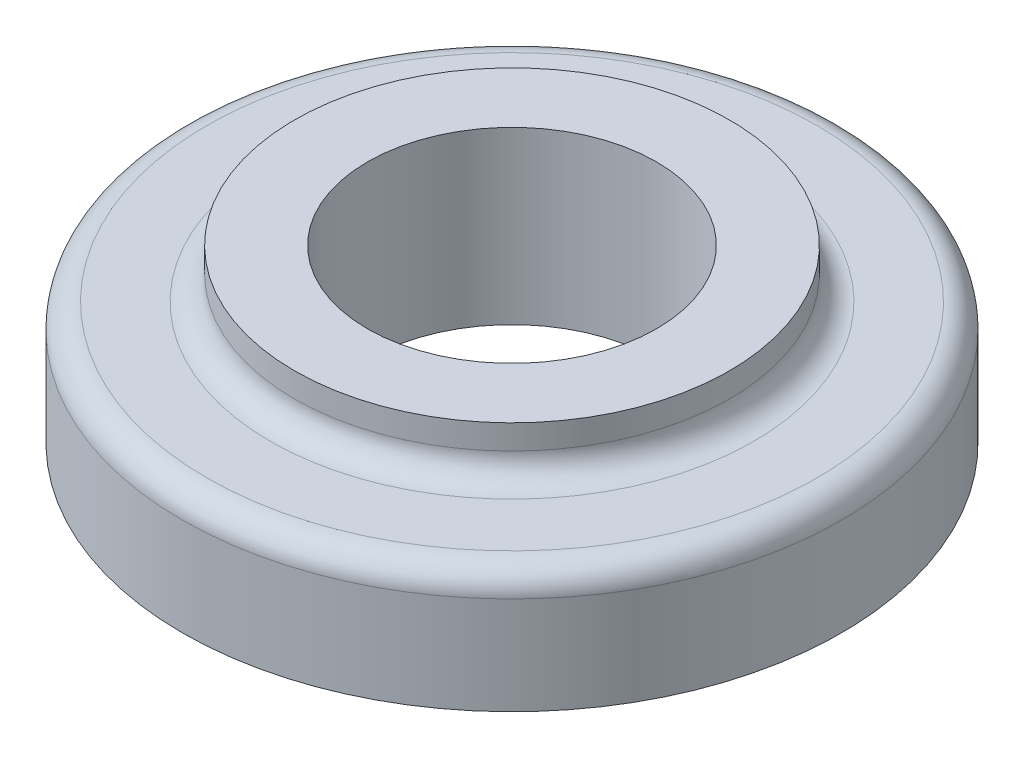
ISO-10303-21;
HEADER;
FILE_DESCRIPTION(('STEP AP214'),'2;1');
FILE_NAME('part.step','',(''),(''),'','','');
FILE_SCHEMA(('AUTOMOTIVE_DESIGN { 1 0 10303 214 1 1 1 1 }'));
ENDSEC;
DATA;
#1=APPLICATION_CONTEXT('core data for automotive mechanical design processes');
#2=APPLICATION_PROTOCOL_DEFINITION('international standard','automotive_design',2000,#1);
#3=PRODUCT_CONTEXT('',#1,'mechanical');
#4=PRODUCT('Part','Part','',(#3));
#5=PRODUCT_RELATED_PRODUCT_CATEGORY('part','',(#4));
#6=PRODUCT_DEFINITION_FORMATION('','',#4);
#7=PRODUCT_DEFINITION_CONTEXT('part definition',#1,'design');
#8=PRODUCT_DEFINITION('design','',#6,#7);
#9=PRODUCT_DEFINITION_SHAPE('','',#8);
#10=(LENGTH_UNIT() NAMED_UNIT(*) SI_UNIT(.MILLI.,.METRE.));
#11=(NAMED_UNIT(*) PLANE_ANGLE_UNIT() SI_UNIT($,.RADIAN.));
#12=(NAMED_UNIT(*) SI_UNIT($,.STERADIAN.) SOLID_ANGLE_UNIT());
#13=UNCERTAINTY_MEASURE_WITH_UNIT(LENGTH_MEASURE(1.E-05),#10,'distance_accuracy_value','');
#14=(GEOMETRIC_REPRESENTATION_CONTEXT(3) GLOBAL_UNCERTAINTY_ASSIGNED_CONTEXT((#13)) GLOBAL_UNIT_ASSIGNED_CONTEXT((#10,
#11,#12)) REPRESENTATION_CONTEXT('',''));
#15=CARTESIAN_POINT('',(0.,0.,0.));
#16=DIRECTION('',(0.,0.,1.));
#17=DIRECTION('',(1.,0.,0.));
#18=AXIS2_PLACEMENT_3D('',#15,#16,#17);
#19=CARTESIAN_POINT('',(0.,10.,0.));
#20=DIRECTION('',(0.,-1.,0.));
#21=DIRECTION('',(0.,0.,-1.));
#22=AXIS2_PLACEMENT_3D('',#19,#20,#21);
#23=CYLINDRICAL_SURFACE('',#22,27.0010222488846);
#24=CARTESIAN_POINT('',(0.,8.,0.));
#25=DIRECTION('',(0.,1.,0.));
#26=DIRECTION('',(0.,0.,1.));
#27=AXIS2_PLACEMENT_3D('',#24,#25,#26);
#28=CIRCLE('',#27,27.0010222488846);
#29=CARTESIAN_POINT('',(0.,8.,27.0010222488846));
#30=VERTEX_POINT('',#29);
#31=EDGE_CURVE('E45',#30,#30,#28,.F.);
#32=ORIENTED_EDGE('',*,*,#31,.T.);
#33=EDGE_LOOP('',(#32));
#34=FACE_BOUND('',#33,.T.);
#35=CARTESIAN_POINT('',(0.,0.,0.));
#36=DIRECTION('',(0.,1.,0.));
#37=DIRECTION('',(0.,0.,1.));
#38=AXIS2_PLACEMENT_3D('',#35,#36,#37);
#39=CIRCLE('',#38,27.0010222488846);
#40=CARTESIAN_POINT('',(0.,0.,27.0010222488846));
#41=VERTEX_POINT('',#40);
#42=EDGE_CURVE('E61',#41,#41,#39,.T.);
#43=ORIENTED_EDGE('',*,*,#42,.T.);
#44=EDGE_LOOP('',(#43));
#45=FACE_BOUND('',#44,.T.);
#46=ADVANCED_FACE('F37',(#34,#45),#23,.T.);
#47=CARTESIAN_POINT('',(0.,10.,0.));
#48=DIRECTION('',(0.,1.,0.));
#49=DIRECTION('',(0.,0.,1.));
#50=AXIS2_PLACEMENT_3D('',#47,#48,#49);
#51=PLANE('',#50);
#52=CARTESIAN_POINT('',(0.,10.,0.));
#53=DIRECTION('',(0.,1.,0.));
#54=DIRECTION('',(0.,0.,1.));
#55=AXIS2_PLACEMENT_3D('',#52,#53,#54);
#56=CIRCLE('',#55,25.0010222488846);
#57=CARTESIAN_POINT('',(0.,10.,25.0010222488846));
#58=VERTEX_POINT('',#57);
#59=EDGE_CURVE('E50',#58,#58,#56,.T.);
#60=ORIENTED_EDGE('',*,*,#59,.T.);
#61=EDGE_LOOP('',(#60));
#62=FACE_BOUND('',#61,.T.);
#63=CARTESIAN_POINT('',(0.,10.,0.));
#64=DIRECTION('',(0.,1.,0.));
#65=DIRECTION('',(0.,0.,1.));
#66=AXIS2_PLACEMENT_3D('',#63,#64,#65);
#67=CIRCLE('',#66,19.8112845061296);
#68=CARTESIAN_POINT('',(0.,10.,19.8112845061296));
#69=VERTEX_POINT('',#68);
#70=EDGE_CURVE('E55',#69,#69,#67,.F.);
#71=ORIENTED_EDGE('',*,*,#70,.T.);
#72=EDGE_LOOP('',(#71));
#73=FACE_BOUND('',#72,.T.);
#74=ADVANCED_FACE('F100',(#62,#73),#51,.T.);
#75=CARTESIAN_POINT('',(0.,0.,0.));
#76=DIRECTION('',(0.,1.,0.));
#77=DIRECTION('',(0.,0.,1.));
#78=AXIS2_PLACEMENT_3D('',#75,#76,#77);
#79=PLANE('',#78);
#80=CARTESIAN_POINT('',(0.,0.,0.));
#81=DIRECTION('',(0.,1.,0.));
#82=DIRECTION('',(0.,0.,1.));
#83=AXIS2_PLACEMENT_3D('',#80,#81,#82);
#84=CIRCLE('',#83,11.8443550233392);
#85=CARTESIAN_POINT('',(0.,0.,11.8443550233392));
#86=VERTEX_POINT('',#85);
#87=EDGE_CURVE('E69',#86,#86,#84,.T.);
#88=ORIENTED_EDGE('',*,*,#87,.T.);
#89=EDGE_LOOP('',(#88));
#90=FACE_BOUND('',#89,.T.);
#91=ORIENTED_EDGE('',*,*,#42,.F.);
#92=EDGE_LOOP('',(#91));
#93=FACE_BOUND('',#92,.T.);
#94=ADVANCED_FACE('F78',(#90,#93),#79,.F.);
#95=CARTESIAN_POINT('',(0.,14.,0.));
#96=DIRECTION('',(0.,-1.,0.));
#97=DIRECTION('',(0.,0.,-1.));
#98=AXIS2_PLACEMENT_3D('',#95,#96,#97);
#99=CYLINDRICAL_SURFACE('',#98,17.8112845061296);
#100=CARTESIAN_POINT('',(0.,12.,0.));
#101=DIRECTION('',(0.,1.,0.));
#102=DIRECTION('',(0.,0.,1.));
#103=AXIS2_PLACEMENT_3D('',#100,#101,#102);
#104=CIRCLE('',#103,17.8112845061296);
#105=CARTESIAN_POINT('',(0.,12.,17.8112845061296));
#106=VERTEX_POINT('',#105);
#107=EDGE_CURVE('E10',#106,#106,#104,.T.);
#108=ORIENTED_EDGE('',*,*,#107,.T.);
#109=EDGE_LOOP('',(#108));
#110=FACE_BOUND('',#109,.T.);
#111=CARTESIAN_POINT('',(0.,14.,0.));
#112=DIRECTION('',(0.,1.,0.));
#113=DIRECTION('',(0.,0.,1.));
#114=AXIS2_PLACEMENT_3D('',#111,#112,#113);
#115=CIRCLE('',#114,17.8112845061296);
#116=CARTESIAN_POINT('',(0.,14.,17.8112845061296));
#117=VERTEX_POINT('',#116);
#118=EDGE_CURVE('E65',#117,#117,#115,.T.);
#119=ORIENTED_EDGE('',*,*,#118,.F.);
#120=EDGE_LOOP('',(#119));
#121=FACE_BOUND('',#120,.T.);
#122=ADVANCED_FACE('F91',(#110,#121),#99,.T.);
#123=CARTESIAN_POINT('',(0.,14.,0.));
#124=DIRECTION('',(0.,1.,0.));
#125=DIRECTION('',(0.,0.,1.));
#126=AXIS2_PLACEMENT_3D('',#123,#124,#125);
#127=PLANE('',#126);
#128=CARTESIAN_POINT('',(0.,14.,0.));
#129=DIRECTION('',(0.,1.,0.));
#130=DIRECTION('',(0.,0.,1.));
#131=AXIS2_PLACEMENT_3D('',#128,#129,#130);
#132=CIRCLE('',#131,11.8443550233392);
#133=CARTESIAN_POINT('',(0.,14.,11.8443550233392));
#134=VERTEX_POINT('',#133);
#135=EDGE_CURVE('E70',#134,#134,#132,.T.);
#136=ORIENTED_EDGE('',*,*,#135,.F.);
#137=EDGE_LOOP('',(#136));
#138=FACE_BOUND('',#137,.T.);
#139=ORIENTED_EDGE('',*,*,#118,.T.);
#140=EDGE_LOOP('',(#139));
#141=FACE_BOUND('',#140,.T.);
#142=ADVANCED_FACE('F85',(#138,#141),#127,.T.);
#143=CARTESIAN_POINT('',(0.,0.,0.));
#144=DIRECTION('',(0.,1.,0.));
#145=DIRECTION('',(0.,0.,1.));
#146=AXIS2_PLACEMENT_3D('',#143,#144,#145);
#147=CYLINDRICAL_SURFACE('',#146,11.8443550233392);
#148=CARTESIAN_POINT('',(0.,0.,11.8443550233392));
#149=CARTESIAN_POINT('',(0.,0.145833333333333,11.8443550233392));
#150=CARTESIAN_POINT('',(0.,0.291666666666667,11.8443550233392));
#151=CARTESIAN_POINT('',(0.,0.583333333333333,11.8443550233392));
#152=CARTESIAN_POINT('',(0.,0.729166666666667,11.8443550233392));
#153=CARTESIAN_POINT('',(0.,1.02083333333333,11.8443550233392));
#154=CARTESIAN_POINT('',(0.,1.16666666666667,11.8443550233392));
#155=CARTESIAN_POINT('',(0.,1.45833333333333,11.8443550233392));
#156=CARTESIAN_POINT('',(0.,1.60416666666667,11.8443550233392));
#157=CARTESIAN_POINT('',(0.,1.89583333333333,11.8443550233392));
#158=CARTESIAN_POINT('',(0.,2.04166666666667,11.8443550233392));
#159=CARTESIAN_POINT('',(0.,2.33333333333333,11.8443550233392));
#160=CARTESIAN_POINT('',(0.,2.47916666666667,11.8443550233392));
#161=CARTESIAN_POINT('',(0.,2.77083333333333,11.8443550233392));
#162=CARTESIAN_POINT('',(0.,2.91666666666667,11.8443550233392));
#163=CARTESIAN_POINT('',(0.,3.20833333333333,11.8443550233392));
#164=CARTESIAN_POINT('',(0.,3.35416666666667,11.8443550233392));
#165=CARTESIAN_POINT('',(0.,3.64583333333333,11.8443550233392));
#166=CARTESIAN_POINT('',(0.,3.79166666666667,11.8443550233392));
#167=CARTESIAN_POINT('',(0.,4.08333333333333,11.8443550233392));
#168=CARTESIAN_POINT('',(0.,4.22916666666667,11.8443550233392));
#169=CARTESIAN_POINT('',(0.,4.52083333333333,11.8443550233392));
#170=CARTESIAN_POINT('',(0.,4.66666666666667,11.8443550233392));
#171=CARTESIAN_POINT('',(0.,4.95833333333333,11.8443550233392));
#172=CARTESIAN_POINT('',(0.,5.10416666666667,11.8443550233392));
#173=CARTESIAN_POINT('',(0.,5.39583333333333,11.8443550233392));
#174=CARTESIAN_POINT('',(0.,5.54166666666667,11.8443550233392));
#175=CARTESIAN_POINT('',(0.,5.83333333333333,11.8443550233392));
#176=CARTESIAN_POINT('',(0.,5.97916666666667,11.8443550233392));
#177=CARTESIAN_POINT('',(0.,6.27083333333333,11.8443550233392));
#178=CARTESIAN_POINT('',(0.,6.41666666666667,11.8443550233392));
#179=CARTESIAN_POINT('',(0.,6.70833333333333,11.8443550233392));
#180=CARTESIAN_POINT('',(0.,6.85416666666666,11.8443550233392));
#181=CARTESIAN_POINT('',(0.,7.14583333333333,11.8443550233392));
#182=CARTESIAN_POINT('',(0.,7.29166666666667,11.8443550233392));
#183=CARTESIAN_POINT('',(0.,7.58333333333333,11.8443550233392));
#184=CARTESIAN_POINT('',(0.,7.72916666666667,11.8443550233392));
#185=CARTESIAN_POINT('',(0.,8.02083333333333,11.8443550233392));
#186=CARTESIAN_POINT('',(0.,8.16666666666666,11.8443550233392));
#187=CARTESIAN_POINT('',(0.,8.45833333333333,11.8443550233392));
#188=CARTESIAN_POINT('',(0.,8.60416666666666,11.8443550233392));
#189=CARTESIAN_POINT('',(0.,8.89583333333333,11.8443550233392));
#190=CARTESIAN_POINT('',(0.,9.04166666666666,11.8443550233392));
#191=CARTESIAN_POINT('',(0.,9.33333333333333,11.8443550233392));
#192=CARTESIAN_POINT('',(0.,9.47916666666666,11.8443550233392));
#193=CARTESIAN_POINT('',(0.,9.77083333333333,11.8443550233392));
#194=CARTESIAN_POINT('',(0.,9.91666666666666,11.8443550233392));
#195=CARTESIAN_POINT('',(0.,10.2083333333333,11.8443550233392));
#196=CARTESIAN_POINT('',(0.,10.3541666666667,11.8443550233392));
#197=CARTESIAN_POINT('',(0.,10.6458333333333,11.8443550233392));
#198=CARTESIAN_POINT('',(0.,10.7916666666667,11.8443550233392));
#199=CARTESIAN_POINT('',(0.,11.0833333333333,11.8443550233392));
#200=CARTESIAN_POINT('',(0.,11.2291666666667,11.8443550233392));
#201=CARTESIAN_POINT('',(0.,11.5208333333333,11.8443550233392));
#202=CARTESIAN_POINT('',(0.,11.6666666666667,11.8443550233392));
#203=CARTESIAN_POINT('',(0.,11.9583333333333,11.8443550233392));
#204=CARTESIAN_POINT('',(0.,12.1041666666667,11.8443550233392));
#205=CARTESIAN_POINT('',(0.,12.3958333333333,11.8443550233392));
#206=CARTESIAN_POINT('',(0.,12.5416666666667,11.8443550233392));
#207=CARTESIAN_POINT('',(0.,12.8333333333333,11.8443550233392));
#208=CARTESIAN_POINT('',(0.,12.9791666666667,11.8443550233392));
#209=CARTESIAN_POINT('',(0.,13.2708333333333,11.8443550233392));
#210=CARTESIAN_POINT('',(0.,13.4166666666667,11.8443550233392));
#211=CARTESIAN_POINT('',(0.,13.7083333333333,11.8443550233392));
#212=CARTESIAN_POINT('',(0.,13.8541666666667,11.8443550233392));
#213=CARTESIAN_POINT('',(0.,14.,11.8443550233392));
#214=B_SPLINE_CURVE_WITH_KNOTS('',3,(#148,#149,#150,#151,#152,#153,#154,#155,#156,#157,#158,
#159,#160,#161,#162,#163,#164,#165,#166,#167,#168,#169,#170,#171,#172,#173,#174,#175,#176,#177,
#178,#179,#180,#181,#182,#183,#184,#185,#186,#187,#188,#189,#190,#191,#192,#193,#194,#195,#196,
#197,#198,#199,#200,#201,#202,#203,#204,#205,#206,#207,#208,#209,#210,#211,#212,#213),
.UNSPECIFIED.,.F.,.F.,(4,2,2,2,2,2,2,2,2,2,2,2,2,2,2,2,2,2,2,2,2,2,2,2,2,2,2,2,2,2,2,2,4),(0.,
0.4375,0.875,1.3125,1.75,2.1875,2.625,3.0625,3.5,3.9375,4.375,4.8125,5.25,5.6875,6.125,6.5625,
7.,7.4375,7.875,8.3125,8.75,9.1875,9.625,10.0625,10.5,10.9375,11.375,11.8125,12.25,12.6875,
13.125,13.5625,14.),.UNSPECIFIED.);
#215=EDGE_CURVE('BSEAM81',#86,#134,#214,.T.);
#216=ORIENTED_EDGE('',*,*,#87,.F.);
#217=ORIENTED_EDGE('',*,*,#135,.T.);
#218=ORIENTED_EDGE('',*,*,#215,.T.);
#219=ORIENTED_EDGE('',*,*,#215,.F.);
#220=EDGE_LOOP('',(#216,#218,#217,#219));
#221=FACE_BOUND('',#220,.T.);
#222=ADVANCED_FACE('F81',(#221),#147,.F.);
#223=CARTESIAN_POINT('',(0.,8.,0.));
#224=DIRECTION('',(0.,1.,0.));
#225=DIRECTION('',(0.,0.,1.));
#226=AXIS2_PLACEMENT_3D('',#223,#224,#225);
#227=TOROIDAL_SURFACE('',#226,25.0010222488846,2.);
#228=ORIENTED_EDGE('',*,*,#31,.F.);
#229=EDGE_LOOP('',(#228));
#230=FACE_BOUND('',#229,.T.);
#231=ORIENTED_EDGE('',*,*,#59,.F.);
#232=EDGE_LOOP('',(#231));
#233=FACE_BOUND('',#232,.T.);
#234=ADVANCED_FACE('F84',(#230,#233),#227,.T.);
#235=CARTESIAN_POINT('',(0.,12.,0.));
#236=DIRECTION('',(0.,1.,0.));
#237=DIRECTION('',(0.,0.,1.));
#238=AXIS2_PLACEMENT_3D('',#235,#236,#237);
#239=TOROIDAL_SURFACE('',#238,19.8112845061296,2.);
#240=ORIENTED_EDGE('',*,*,#70,.F.);
#241=EDGE_LOOP('',(#240));
#242=FACE_BOUND('',#241,.T.);
#243=ORIENTED_EDGE('',*,*,#107,.F.);
#244=EDGE_LOOP('',(#243));
#245=FACE_BOUND('',#244,.T.);
#246=ADVANCED_FACE('F39',(#242,#245),#239,.F.);
#247=CLOSED_SHELL('',(#46,#74,#94,#122,#142,#222,#234,#246));
#248=MANIFOLD_SOLID_BREP('B2',#247);
#249=ADVANCED_BREP_SHAPE_REPRESENTATION('',(#18,#248),#14);
#250=SHAPE_DEFINITION_REPRESENTATION(#9,#249);
ENDSEC;
END-ISO-10303-21;
